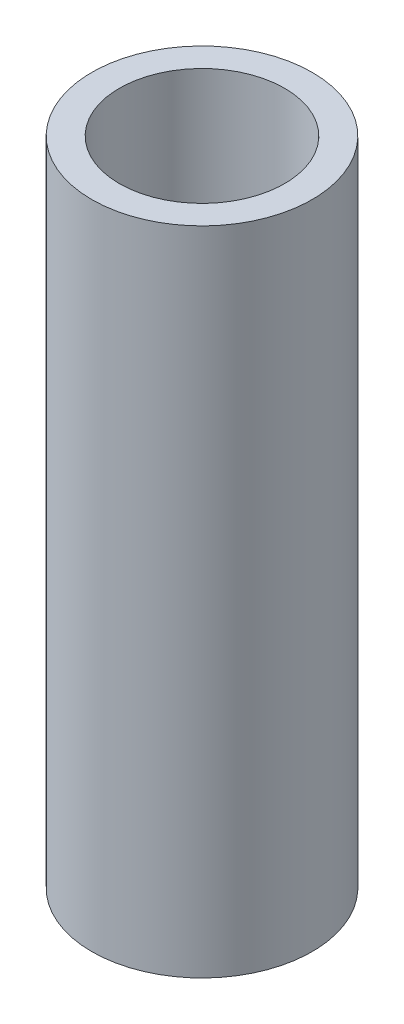
ISO-10303-21;
HEADER;
FILE_DESCRIPTION(('STEP AP214'),'2;1');
FILE_NAME('part.step','',(''),(''),'','','');
FILE_SCHEMA(('AUTOMOTIVE_DESIGN { 1 0 10303 214 1 1 1 1 }'));
ENDSEC;
DATA;
#1=APPLICATION_CONTEXT('core data for automotive mechanical design processes');
#2=APPLICATION_PROTOCOL_DEFINITION('international standard','automotive_design',2000,#1);
#3=PRODUCT_CONTEXT('',#1,'mechanical');
#4=PRODUCT('Part','Part','',(#3));
#5=PRODUCT_RELATED_PRODUCT_CATEGORY('part','',(#4));
#6=PRODUCT_DEFINITION_FORMATION('','',#4);
#7=PRODUCT_DEFINITION_CONTEXT('part definition',#1,'design');
#8=PRODUCT_DEFINITION('design','',#6,#7);
#9=PRODUCT_DEFINITION_SHAPE('','',#8);
#10=(LENGTH_UNIT() NAMED_UNIT(*) SI_UNIT(.MILLI.,.METRE.));
#11=(NAMED_UNIT(*) PLANE_ANGLE_UNIT() SI_UNIT($,.RADIAN.));
#12=(NAMED_UNIT(*) SI_UNIT($,.STERADIAN.) SOLID_ANGLE_UNIT());
#13=UNCERTAINTY_MEASURE_WITH_UNIT(LENGTH_MEASURE(1.E-05),#10,'distance_accuracy_value','');
#14=(GEOMETRIC_REPRESENTATION_CONTEXT(3) GLOBAL_UNCERTAINTY_ASSIGNED_CONTEXT((#13)) GLOBAL_UNIT_ASSIGNED_CONTEXT((#10,
#11,#12)) REPRESENTATION_CONTEXT('',''));
#15=CARTESIAN_POINT('',(0.,0.,0.));
#16=DIRECTION('',(0.,0.,1.));
#17=DIRECTION('',(1.,0.,0.));
#18=AXIS2_PLACEMENT_3D('',#15,#16,#17);
#19=CARTESIAN_POINT('',(0.,0.,0.));
#20=DIRECTION('',(0.,-1.,0.));
#21=DIRECTION('',(0.,0.,-1.));
#22=AXIS2_PLACEMENT_3D('',#19,#20,#21);
#23=PLANE('',#22);
#24=CARTESIAN_POINT('',(0.,0.,0.));
#25=DIRECTION('',(0.,1.,0.));
#26=DIRECTION('',(0.,0.,1.));
#27=AXIS2_PLACEMENT_3D('',#24,#25,#26);
#28=CIRCLE('',#27,7.5);
#29=CARTESIAN_POINT('',(0.,0.,7.5));
#30=VERTEX_POINT('',#29);
#31=EDGE_CURVE('E60',#30,#30,#28,.T.);
#32=ORIENTED_EDGE('',*,*,#31,.F.);
#33=EDGE_LOOP('',(#32));
#34=FACE_BOUND('',#33,.T.);
#35=CARTESIAN_POINT('',(0.,0.,0.));
#36=DIRECTION('',(0.,-1.,0.));
#37=DIRECTION('',(0.,0.,-1.));
#38=AXIS2_PLACEMENT_3D('',#35,#36,#37);
#39=CIRCLE('',#38,10.);
#40=CARTESIAN_POINT('',(0.,0.,-10.));
#41=VERTEX_POINT('',#40);
#42=EDGE_CURVE('E53',#41,#41,#39,.T.);
#43=ORIENTED_EDGE('',*,*,#42,.F.);
#44=EDGE_LOOP('',(#43));
#45=FACE_BOUND('',#44,.T.);
#46=ADVANCED_FACE('F45',(#34,#45),#23,.F.);
#47=CARTESIAN_POINT('',(0.,-59.1089185004633,0.));
#48=DIRECTION('',(0.,-1.,0.));
#49=DIRECTION('',(0.,0.,-1.));
#50=AXIS2_PLACEMENT_3D('',#47,#48,#49);
#51=PLANE('',#50);
#52=CARTESIAN_POINT('',(0.,-59.1089185004633,0.));
#53=DIRECTION('',(0.,-1.,0.));
#54=DIRECTION('',(0.,0.,-1.));
#55=AXIS2_PLACEMENT_3D('',#52,#53,#54);
#56=CIRCLE('',#55,7.5);
#57=CARTESIAN_POINT('',(0.,-59.1089185004633,-7.5));
#58=VERTEX_POINT('',#57);
#59=EDGE_CURVE('E48',#58,#58,#56,.T.);
#60=ORIENTED_EDGE('',*,*,#59,.F.);
#61=EDGE_LOOP('',(#60));
#62=FACE_BOUND('',#61,.T.);
#63=CARTESIAN_POINT('',(0.,-59.1089185004633,0.));
#64=DIRECTION('',(0.,-1.,0.));
#65=DIRECTION('',(0.,0.,-1.));
#66=AXIS2_PLACEMENT_3D('',#63,#64,#65);
#67=CIRCLE('',#66,10.);
#68=CARTESIAN_POINT('',(0.,-59.1089185004633,-10.));
#69=VERTEX_POINT('',#68);
#70=EDGE_CURVE('E11',#69,#69,#67,.T.);
#71=ORIENTED_EDGE('',*,*,#70,.T.);
#72=EDGE_LOOP('',(#71));
#73=FACE_BOUND('',#72,.T.);
#74=ADVANCED_FACE('F71',(#62,#73),#51,.T.);
#75=CARTESIAN_POINT('',(0.,0.,0.));
#76=DIRECTION('',(0.,-1.,0.));
#77=DIRECTION('',(0.,0.,-1.));
#78=AXIS2_PLACEMENT_3D('',#75,#76,#77);
#79=CYLINDRICAL_SURFACE('',#78,10.);
#80=ORIENTED_EDGE('',*,*,#70,.F.);
#81=EDGE_LOOP('',(#80));
#82=FACE_BOUND('',#81,.T.);
#83=ORIENTED_EDGE('',*,*,#42,.T.);
#84=EDGE_LOOP('',(#83));
#85=FACE_BOUND('',#84,.T.);
#86=ADVANCED_FACE('F73',(#82,#85),#79,.T.);
#87=CARTESIAN_POINT('',(0.,-70.,0.));
#88=DIRECTION('',(0.,1.,0.));
#89=DIRECTION('',(0.,0.,1.));
#90=AXIS2_PLACEMENT_3D('',#87,#88,#89);
#91=CYLINDRICAL_SURFACE('',#90,7.5);
#92=ORIENTED_EDGE('',*,*,#59,.T.);
#93=EDGE_LOOP('',(#92));
#94=FACE_BOUND('',#93,.T.);
#95=ORIENTED_EDGE('',*,*,#31,.T.);
#96=EDGE_LOOP('',(#95));
#97=FACE_BOUND('',#96,.T.);
#98=ADVANCED_FACE('F69',(#94,#97),#91,.F.);
#99=CLOSED_SHELL('',(#46,#74,#86,#98));
#100=MANIFOLD_SOLID_BREP('B2',#99);
#101=ADVANCED_BREP_SHAPE_REPRESENTATION('',(#18,#100),#14);
#102=SHAPE_DEFINITION_REPRESENTATION(#9,#101);
ENDSEC;
END-ISO-10303-21;
